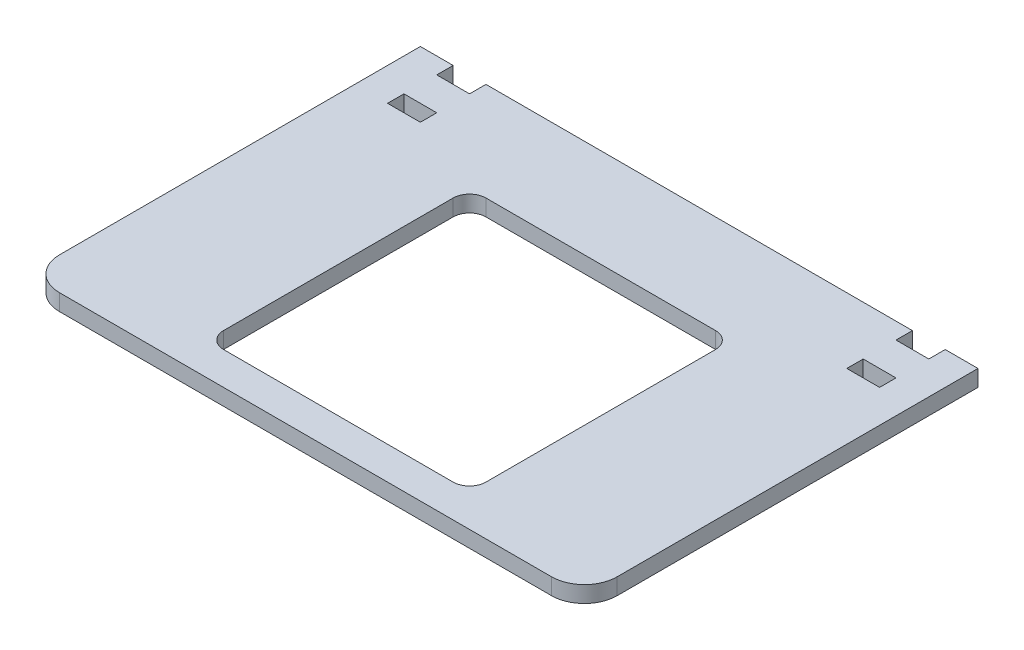
ISO-10303-21;
HEADER;
FILE_DESCRIPTION(('STEP AP214'),'2;1');
FILE_NAME('part.step','',(''),(''),'','','');
FILE_SCHEMA(('AUTOMOTIVE_DESIGN { 1 0 10303 214 1 1 1 1 }'));
ENDSEC;
DATA;
#1=APPLICATION_CONTEXT('core data for automotive mechanical design processes');
#2=APPLICATION_PROTOCOL_DEFINITION('international standard','automotive_design',2000,#1);
#3=PRODUCT_CONTEXT('',#1,'mechanical');
#4=PRODUCT('Part','Part','',(#3));
#5=PRODUCT_RELATED_PRODUCT_CATEGORY('part','',(#4));
#6=PRODUCT_DEFINITION_FORMATION('','',#4);
#7=PRODUCT_DEFINITION_CONTEXT('part definition',#1,'design');
#8=PRODUCT_DEFINITION('design','',#6,#7);
#9=PRODUCT_DEFINITION_SHAPE('','',#8);
#10=(LENGTH_UNIT() NAMED_UNIT(*) SI_UNIT(.MILLI.,.METRE.));
#11=(NAMED_UNIT(*) PLANE_ANGLE_UNIT() SI_UNIT($,.RADIAN.));
#12=(NAMED_UNIT(*) SI_UNIT($,.STERADIAN.) SOLID_ANGLE_UNIT());
#13=UNCERTAINTY_MEASURE_WITH_UNIT(LENGTH_MEASURE(1.E-05),#10,'distance_accuracy_value','');
#14=(GEOMETRIC_REPRESENTATION_CONTEXT(3) GLOBAL_UNCERTAINTY_ASSIGNED_CONTEXT((#13)) GLOBAL_UNIT_ASSIGNED_CONTEXT((#10,
#11,#12)) REPRESENTATION_CONTEXT('',''));
#15=CARTESIAN_POINT('',(0.,0.,0.));
#16=DIRECTION('',(0.,0.,1.));
#17=DIRECTION('',(1.,0.,0.));
#18=AXIS2_PLACEMENT_3D('',#15,#16,#17);
#19=CARTESIAN_POINT('',(-107.95,6.35,-76.2));
#20=DIRECTION('',(0.,0.,1.));
#21=DIRECTION('',(1.,0.,0.));
#22=AXIS2_PLACEMENT_3D('',#19,#20,#21);
#23=PLANE('',#22);
#24=DIRECTION('',(-1.,0.,0.));
#25=VECTOR('',#24,1.);
#26=CARTESIAN_POINT('',(-107.95,0.,-76.2));
#27=LINE('',#26,#25);
#28=CARTESIAN_POINT('',(107.95,0.,-76.2));
#29=VERTEX_POINT('',#28);
#30=CARTESIAN_POINT('',(95.25,0.,-76.2));
#31=VERTEX_POINT('',#30);
#32=EDGE_CURVE('E512',#29,#31,#27,.T.);
#33=ORIENTED_EDGE('',*,*,#32,.T.);
#34=DIRECTION('',(0.,1.,0.));
#35=VECTOR('',#34,1.);
#36=CARTESIAN_POINT('',(95.25,0.,-76.2));
#37=LINE('',#36,#35);
#38=CARTESIAN_POINT('',(95.25,6.35,-76.2));
#39=VERTEX_POINT('',#38);
#40=EDGE_CURVE('E405',#31,#39,#37,.T.);
#41=ORIENTED_EDGE('',*,*,#40,.T.);
#42=DIRECTION('',(-1.,0.,0.));
#43=VECTOR('',#42,1.);
#44=CARTESIAN_POINT('',(-107.95,6.35,-76.2));
#45=LINE('',#44,#43);
#46=CARTESIAN_POINT('',(107.95,6.35,-76.2));
#47=VERTEX_POINT('',#46);
#48=EDGE_CURVE('E495',#47,#39,#45,.T.);
#49=ORIENTED_EDGE('',*,*,#48,.F.);
#50=DIRECTION('',(0.,-1.,0.));
#51=VECTOR('',#50,1.);
#52=CARTESIAN_POINT('',(107.95,6.35,-76.2));
#53=LINE('',#52,#51);
#54=EDGE_CURVE('E527',#47,#29,#53,.T.);
#55=ORIENTED_EDGE('',*,*,#54,.T.);
#56=EDGE_LOOP('',(#33,#41,#49,#55));
#57=FACE_BOUND('',#56,.T.);
#58=ADVANCED_FACE('F39',(#57),#23,.F.);
#59=CARTESIAN_POINT('',(82.55,6.35,-76.2));
#60=VERTEX_POINT('',#59);
#61=CARTESIAN_POINT('',(-82.55,6.35,-76.2));
#62=VERTEX_POINT('',#61);
#63=EDGE_CURVE('E500',#60,#62,#45,.T.);
#64=ORIENTED_EDGE('',*,*,#63,.F.);
#65=DIRECTION('',(0.,1.,0.));
#66=VECTOR('',#65,1.);
#67=CARTESIAN_POINT('',(82.55,0.,-76.2));
#68=LINE('',#67,#66);
#69=CARTESIAN_POINT('',(82.55,0.,-76.2));
#70=VERTEX_POINT('',#69);
#71=EDGE_CURVE('E413',#70,#60,#68,.T.);
#72=ORIENTED_EDGE('',*,*,#71,.F.);
#73=CARTESIAN_POINT('',(-82.55,0.,-76.2));
#74=VERTEX_POINT('',#73);
#75=EDGE_CURVE('E517',#70,#74,#27,.T.);
#76=ORIENTED_EDGE('',*,*,#75,.T.);
#77=DIRECTION('',(0.,1.,0.));
#78=VECTOR('',#77,1.);
#79=CARTESIAN_POINT('',(-82.55,0.,-76.2));
#80=LINE('',#79,#78);
#81=EDGE_CURVE('E430',#74,#62,#80,.T.);
#82=ORIENTED_EDGE('',*,*,#81,.T.);
#83=EDGE_LOOP('',(#64,#72,#76,#82));
#84=FACE_BOUND('',#83,.T.);
#85=ADVANCED_FACE('F582',(#84),#23,.F.);
#86=CARTESIAN_POINT('',(107.95,6.35,-76.2));
#87=DIRECTION('',(-1.,0.,0.));
#88=DIRECTION('',(0.,0.,1.));
#89=AXIS2_PLACEMENT_3D('',#86,#87,#88);
#90=PLANE('',#89);
#91=DIRECTION('',(0.,0.,-1.));
#92=VECTOR('',#91,1.);
#93=CARTESIAN_POINT('',(107.95,6.35,-76.2));
#94=LINE('',#93,#92);
#95=CARTESIAN_POINT('',(107.95,6.35,63.4999999999999));
#96=VERTEX_POINT('',#95);
#97=EDGE_CURVE('E490',#96,#47,#94,.T.);
#98=ORIENTED_EDGE('',*,*,#97,.F.);
#99=DIRECTION('',(0.,-1.,0.));
#100=VECTOR('',#99,1.);
#101=CARTESIAN_POINT('',(107.95,6.35,63.5));
#102=LINE('',#101,#100);
#103=CARTESIAN_POINT('',(107.95,0.,63.4999999999999));
#104=VERTEX_POINT('',#103);
#105=EDGE_CURVE('E11',#96,#104,#102,.T.);
#106=ORIENTED_EDGE('',*,*,#105,.T.);
#107=DIRECTION('',(0.,0.,-1.));
#108=VECTOR('',#107,1.);
#109=CARTESIAN_POINT('',(107.95,0.,-76.2));
#110=LINE('',#109,#108);
#111=EDGE_CURVE('E489',#104,#29,#110,.T.);
#112=ORIENTED_EDGE('',*,*,#111,.T.);
#113=ORIENTED_EDGE('',*,*,#54,.F.);
#114=EDGE_LOOP('',(#98,#106,#112,#113));
#115=FACE_BOUND('',#114,.T.);
#116=ADVANCED_FACE('F615',(#115),#90,.F.);
#117=CARTESIAN_POINT('',(-95.25,6.35,-76.2));
#118=VERTEX_POINT('',#117);
#119=CARTESIAN_POINT('',(-107.95,6.35,-76.2));
#120=VERTEX_POINT('',#119);
#121=EDGE_CURVE('E493',#118,#120,#45,.T.);
#122=ORIENTED_EDGE('',*,*,#121,.F.);
#123=DIRECTION('',(0.,1.,0.));
#124=VECTOR('',#123,1.);
#125=CARTESIAN_POINT('',(-95.25,0.,-76.2));
#126=LINE('',#125,#124);
#127=CARTESIAN_POINT('',(-95.25,0.,-76.2));
#128=VERTEX_POINT('',#127);
#129=EDGE_CURVE('E440',#128,#118,#126,.T.);
#130=ORIENTED_EDGE('',*,*,#129,.F.);
#131=CARTESIAN_POINT('',(-107.95,0.,-76.2));
#132=VERTEX_POINT('',#131);
#133=EDGE_CURVE('E511',#128,#132,#27,.T.);
#134=ORIENTED_EDGE('',*,*,#133,.T.);
#135=DIRECTION('',(0.,-1.,0.));
#136=VECTOR('',#135,1.);
#137=CARTESIAN_POINT('',(-107.95,6.35,-76.2));
#138=LINE('',#137,#136);
#139=EDGE_CURVE('E508',#120,#132,#138,.T.);
#140=ORIENTED_EDGE('',*,*,#139,.F.);
#141=EDGE_LOOP('',(#122,#130,#134,#140));
#142=FACE_BOUND('',#141,.T.);
#143=ADVANCED_FACE('F573',(#142),#23,.F.);
#144=CARTESIAN_POINT('',(-107.95,6.35,-76.2));
#145=DIRECTION('',(1.,0.,0.));
#146=DIRECTION('',(0.,0.,-1.));
#147=AXIS2_PLACEMENT_3D('',#144,#145,#146);
#148=PLANE('',#147);
#149=DIRECTION('',(0.,0.,1.));
#150=VECTOR('',#149,1.);
#151=CARTESIAN_POINT('',(-107.95,0.,-76.2));
#152=LINE('',#151,#150);
#153=CARTESIAN_POINT('',(-107.95,0.,63.4999999999999));
#154=VERTEX_POINT('',#153);
#155=EDGE_CURVE('E516',#132,#154,#152,.T.);
#156=ORIENTED_EDGE('',*,*,#155,.T.);
#157=DIRECTION('',(0.,-1.,0.));
#158=VECTOR('',#157,1.);
#159=CARTESIAN_POINT('',(-107.95,6.35,63.5));
#160=LINE('',#159,#158);
#161=CARTESIAN_POINT('',(-107.95,6.35,63.4999999999999));
#162=VERTEX_POINT('',#161);
#163=EDGE_CURVE('E544',#154,#162,#160,.F.);
#164=ORIENTED_EDGE('',*,*,#163,.T.);
#165=DIRECTION('',(0.,0.,1.));
#166=VECTOR('',#165,1.);
#167=CARTESIAN_POINT('',(-107.95,6.35,-76.2));
#168=LINE('',#167,#166);
#169=EDGE_CURVE('E499',#120,#162,#168,.T.);
#170=ORIENTED_EDGE('',*,*,#169,.F.);
#171=ORIENTED_EDGE('',*,*,#139,.T.);
#172=EDGE_LOOP('',(#156,#164,#170,#171));
#173=FACE_BOUND('',#172,.T.);
#174=ADVANCED_FACE('F569',(#173),#148,.F.);
#175=CARTESIAN_POINT('',(-107.95,6.35,76.2));
#176=DIRECTION('',(0.,0.,-1.));
#177=DIRECTION('',(-1.,0.,0.));
#178=AXIS2_PLACEMENT_3D('',#175,#176,#177);
#179=PLANE('',#178);
#180=DIRECTION('',(1.,0.,0.));
#181=VECTOR('',#180,1.);
#182=CARTESIAN_POINT('',(-107.95,6.35,76.2));
#183=LINE('',#182,#181);
#184=CARTESIAN_POINT('',(-95.25,6.35,76.2));
#185=VERTEX_POINT('',#184);
#186=CARTESIAN_POINT('',(95.25,6.35,76.2));
#187=VERTEX_POINT('',#186);
#188=EDGE_CURVE('E504',#185,#187,#183,.T.);
#189=ORIENTED_EDGE('',*,*,#188,.F.);
#190=DIRECTION('',(0.,-1.,0.));
#191=VECTOR('',#190,1.);
#192=CARTESIAN_POINT('',(-95.25,6.35,76.2));
#193=LINE('',#192,#191);
#194=CARTESIAN_POINT('',(-95.25,0.,76.2));
#195=VERTEX_POINT('',#194);
#196=EDGE_CURVE('E534',#185,#195,#193,.T.);
#197=ORIENTED_EDGE('',*,*,#196,.T.);
#198=DIRECTION('',(1.,0.,0.));
#199=VECTOR('',#198,1.);
#200=CARTESIAN_POINT('',(-107.95,0.,76.2));
#201=LINE('',#200,#199);
#202=CARTESIAN_POINT('',(95.25,0.,76.2));
#203=VERTEX_POINT('',#202);
#204=EDGE_CURVE('E494',#195,#203,#201,.T.);
#205=ORIENTED_EDGE('',*,*,#204,.T.);
#206=DIRECTION('',(0.,-1.,0.));
#207=VECTOR('',#206,1.);
#208=CARTESIAN_POINT('',(95.25,6.35,76.2));
#209=LINE('',#208,#207);
#210=EDGE_CURVE('E531',#203,#187,#209,.F.);
#211=ORIENTED_EDGE('',*,*,#210,.T.);
#212=EDGE_LOOP('',(#189,#197,#205,#211));
#213=FACE_BOUND('',#212,.T.);
#214=ADVANCED_FACE('F561',(#213),#179,.F.);
#215=CARTESIAN_POINT('',(0.,6.35,0.));
#216=DIRECTION('',(0.,1.,0.));
#217=DIRECTION('',(0.,0.,1.));
#218=AXIS2_PLACEMENT_3D('',#215,#216,#217);
#219=PLANE('',#218);
#220=CARTESIAN_POINT('',(-44.45,6.35,57.1500000000001));
#221=DIRECTION('',(0.,1.,0.));
#222=DIRECTION('',(0.,0.,1.));
#223=AXIS2_PLACEMENT_3D('',#220,#221,#222);
#224=CIRCLE('',#223,6.35);
#225=CARTESIAN_POINT('',(-50.8,6.35,57.15));
#226=VERTEX_POINT('',#225);
#227=CARTESIAN_POINT('',(-44.4499999999999,6.35,63.5000000000001));
#228=VERTEX_POINT('',#227);
#229=EDGE_CURVE('E55',#226,#228,#224,.T.);
#230=ORIENTED_EDGE('',*,*,#229,.F.);
#231=DIRECTION('',(0.,0.,1.));
#232=VECTOR('',#231,1.);
#233=CARTESIAN_POINT('',(-50.8,6.35,-31.7499999999999));
#234=LINE('',#233,#232);
#235=CARTESIAN_POINT('',(-50.8,6.35,-31.7499999999999));
#236=VERTEX_POINT('',#235);
#237=EDGE_CURVE('E259',#236,#226,#234,.T.);
#238=ORIENTED_EDGE('',*,*,#237,.F.);
#239=CARTESIAN_POINT('',(-44.45,6.35,-31.7499999999999));
#240=DIRECTION('',(0.,1.,0.));
#241=DIRECTION('',(0.,0.,1.));
#242=AXIS2_PLACEMENT_3D('',#239,#240,#241);
#243=CIRCLE('',#242,6.35);
#244=CARTESIAN_POINT('',(-44.4499999999999,6.35,-38.0999999999999));
#245=VERTEX_POINT('',#244);
#246=EDGE_CURVE('E263',#245,#236,#243,.T.);
#247=ORIENTED_EDGE('',*,*,#246,.F.);
#248=DIRECTION('',(-1.,0.,0.));
#249=VECTOR('',#248,1.);
#250=CARTESIAN_POINT('',(-44.4499999999999,6.35,-38.0999999999999));
#251=LINE('',#250,#249);
#252=CARTESIAN_POINT('',(44.45,6.35,-38.0999999999999));
#253=VERTEX_POINT('',#252);
#254=EDGE_CURVE('E302',#253,#245,#251,.T.);
#255=ORIENTED_EDGE('',*,*,#254,.F.);
#256=CARTESIAN_POINT('',(44.45,6.35,-31.7499999999999));
#257=DIRECTION('',(0.,1.,0.));
#258=DIRECTION('',(0.,0.,-1.));
#259=AXIS2_PLACEMENT_3D('',#256,#257,#258);
#260=CIRCLE('',#259,6.35);
#261=CARTESIAN_POINT('',(50.8,6.35,-31.7499999999999));
#262=VERTEX_POINT('',#261);
#263=EDGE_CURVE('E298',#262,#253,#260,.T.);
#264=ORIENTED_EDGE('',*,*,#263,.F.);
#265=DIRECTION('',(0.,0.,-1.));
#266=VECTOR('',#265,1.);
#267=CARTESIAN_POINT('',(50.8,6.35,-31.7499999999999));
#268=LINE('',#267,#266);
#269=CARTESIAN_POINT('',(50.8,6.35,57.15));
#270=VERTEX_POINT('',#269);
#271=EDGE_CURVE('E294',#270,#262,#268,.T.);
#272=ORIENTED_EDGE('',*,*,#271,.F.);
#273=CARTESIAN_POINT('',(44.45,6.35,57.1500000000001));
#274=DIRECTION('',(0.,1.,0.));
#275=DIRECTION('',(0.,0.,1.));
#276=AXIS2_PLACEMENT_3D('',#273,#274,#275);
#277=CIRCLE('',#276,6.35);
#278=CARTESIAN_POINT('',(44.45,6.35,63.5000000000001));
#279=VERTEX_POINT('',#278);
#280=EDGE_CURVE('E290',#279,#270,#277,.T.);
#281=ORIENTED_EDGE('',*,*,#280,.F.);
#282=DIRECTION('',(1.,0.,0.));
#283=VECTOR('',#282,1.);
#284=CARTESIAN_POINT('',(-44.4499999999999,6.35,63.5000000000001));
#285=LINE('',#284,#283);
#286=EDGE_CURVE('E287',#228,#279,#285,.T.);
#287=ORIENTED_EDGE('',*,*,#286,.F.);
#288=EDGE_LOOP('',(#230,#238,#247,#255,#264,#272,#281,#287));
#289=FACE_BOUND('',#288,.T.);
#290=ORIENTED_EDGE('',*,*,#169,.T.);
#291=CARTESIAN_POINT('',(-95.25,6.35,63.5));
#292=DIRECTION('',(0.,1.,0.));
#293=DIRECTION('',(0.,0.,1.));
#294=AXIS2_PLACEMENT_3D('',#291,#292,#293);
#295=CIRCLE('',#294,12.7);
#296=EDGE_CURVE('E48',#162,#185,#295,.T.);
#297=ORIENTED_EDGE('',*,*,#296,.T.);
#298=ORIENTED_EDGE('',*,*,#188,.T.);
#299=CARTESIAN_POINT('',(95.25,6.35,63.5));
#300=DIRECTION('',(0.,1.,0.));
#301=DIRECTION('',(0.,0.,1.));
#302=AXIS2_PLACEMENT_3D('',#299,#300,#301);
#303=CIRCLE('',#302,12.7);
#304=EDGE_CURVE('E547',#187,#96,#303,.T.);
#305=ORIENTED_EDGE('',*,*,#304,.T.);
#306=ORIENTED_EDGE('',*,*,#97,.T.);
#307=ORIENTED_EDGE('',*,*,#48,.T.);
#308=DIRECTION('',(0.,0.,-1.));
#309=VECTOR('',#308,1.);
#310=CARTESIAN_POINT('',(95.25,6.35,0.));
#311=LINE('',#310,#309);
#312=CARTESIAN_POINT('',(95.25,6.35,-69.85));
#313=VERTEX_POINT('',#312);
#314=EDGE_CURVE('E486',#313,#39,#311,.T.);
#315=ORIENTED_EDGE('',*,*,#314,.F.);
#316=DIRECTION('',(1.,0.,0.));
#317=VECTOR('',#316,1.);
#318=CARTESIAN_POINT('',(0.,6.35,-69.85));
#319=LINE('',#318,#317);
#320=CARTESIAN_POINT('',(82.55,6.35,-69.85));
#321=VERTEX_POINT('',#320);
#322=EDGE_CURVE('E483',#321,#313,#319,.T.);
#323=ORIENTED_EDGE('',*,*,#322,.F.);
#324=DIRECTION('',(0.,0.,1.));
#325=VECTOR('',#324,1.);
#326=CARTESIAN_POINT('',(82.55,6.35,0.));
#327=LINE('',#326,#325);
#328=EDGE_CURVE('E480',#60,#321,#327,.T.);
#329=ORIENTED_EDGE('',*,*,#328,.F.);
#330=ORIENTED_EDGE('',*,*,#63,.T.);
#331=DIRECTION('',(0.,0.,-1.));
#332=VECTOR('',#331,1.);
#333=CARTESIAN_POINT('',(-82.55,6.35,0.));
#334=LINE('',#333,#332);
#335=CARTESIAN_POINT('',(-82.55,6.35,-69.85));
#336=VERTEX_POINT('',#335);
#337=EDGE_CURVE('E451',#336,#62,#334,.T.);
#338=ORIENTED_EDGE('',*,*,#337,.F.);
#339=DIRECTION('',(1.,0.,0.));
#340=VECTOR('',#339,1.);
#341=CARTESIAN_POINT('',(0.,6.35,-69.85));
#342=LINE('',#341,#340);
#343=CARTESIAN_POINT('',(-95.25,6.35,-69.85));
#344=VERTEX_POINT('',#343);
#345=EDGE_CURVE('E448',#344,#336,#342,.T.);
#346=ORIENTED_EDGE('',*,*,#345,.F.);
#347=DIRECTION('',(0.,0.,1.));
#348=VECTOR('',#347,1.);
#349=CARTESIAN_POINT('',(-95.25,6.35,0.));
#350=LINE('',#349,#348);
#351=EDGE_CURVE('E435',#118,#344,#350,.T.);
#352=ORIENTED_EDGE('',*,*,#351,.F.);
#353=ORIENTED_EDGE('',*,*,#121,.T.);
#354=EDGE_LOOP('',(#290,#297,#298,#305,#306,#307,#315,#323,#329,#330,#338,#346,#352,#353));
#355=FACE_BOUND('',#354,.T.);
#356=DIRECTION('',(0.,0.,-1.));
#357=VECTOR('',#356,1.);
#358=CARTESIAN_POINT('',(95.25,6.35,0.));
#359=LINE('',#358,#357);
#360=CARTESIAN_POINT('',(95.25,6.35,-50.8));
#361=VERTEX_POINT('',#360);
#362=CARTESIAN_POINT('',(95.25,6.35,-57.15));
#363=VERTEX_POINT('',#362);
#364=EDGE_CURVE('E476',#361,#363,#359,.T.);
#365=ORIENTED_EDGE('',*,*,#364,.F.);
#366=DIRECTION('',(1.,0.,0.));
#367=VECTOR('',#366,1.);
#368=CARTESIAN_POINT('',(0.,6.35,-50.8));
#369=LINE('',#368,#367);
#370=CARTESIAN_POINT('',(82.5500000000001,6.35,-50.8));
#371=VERTEX_POINT('',#370);
#372=EDGE_CURVE('E473',#371,#361,#369,.T.);
#373=ORIENTED_EDGE('',*,*,#372,.F.);
#374=DIRECTION('',(0.,0.,1.));
#375=VECTOR('',#374,1.);
#376=CARTESIAN_POINT('',(82.5500000000001,6.35,0.));
#377=LINE('',#376,#375);
#378=CARTESIAN_POINT('',(82.5500000000001,6.35,-57.15));
#379=VERTEX_POINT('',#378);
#380=EDGE_CURVE('E470',#379,#371,#377,.T.);
#381=ORIENTED_EDGE('',*,*,#380,.F.);
#382=DIRECTION('',(-1.,0.,0.));
#383=VECTOR('',#382,1.);
#384=CARTESIAN_POINT('',(0.,6.35,-57.15));
#385=LINE('',#384,#383);
#386=EDGE_CURVE('E467',#363,#379,#385,.T.);
#387=ORIENTED_EDGE('',*,*,#386,.F.);
#388=EDGE_LOOP('',(#365,#373,#381,#387));
#389=FACE_BOUND('',#388,.T.);
#390=DIRECTION('',(0.,0.,-1.));
#391=VECTOR('',#390,1.);
#392=CARTESIAN_POINT('',(-82.5500000000001,6.35,0.));
#393=LINE('',#392,#391);
#394=CARTESIAN_POINT('',(-82.5500000000001,6.35,-50.8));
#395=VERTEX_POINT('',#394);
#396=CARTESIAN_POINT('',(-82.5500000000001,6.35,-57.15));
#397=VERTEX_POINT('',#396);
#398=EDGE_CURVE('E463',#395,#397,#393,.T.);
#399=ORIENTED_EDGE('',*,*,#398,.F.);
#400=DIRECTION('',(1.,0.,0.));
#401=VECTOR('',#400,1.);
#402=CARTESIAN_POINT('',(0.,6.35,-50.8));
#403=LINE('',#402,#401);
#404=CARTESIAN_POINT('',(-95.25,6.35,-50.8));
#405=VERTEX_POINT('',#404);
#406=EDGE_CURVE('E460',#405,#395,#403,.T.);
#407=ORIENTED_EDGE('',*,*,#406,.F.);
#408=DIRECTION('',(0.,0.,1.));
#409=VECTOR('',#408,1.);
#410=CARTESIAN_POINT('',(-95.25,6.35,0.));
#411=LINE('',#410,#409);
#412=CARTESIAN_POINT('',(-95.25,6.35,-57.15));
#413=VERTEX_POINT('',#412);
#414=EDGE_CURVE('E457',#413,#405,#411,.T.);
#415=ORIENTED_EDGE('',*,*,#414,.F.);
#416=DIRECTION('',(-1.,0.,0.));
#417=VECTOR('',#416,1.);
#418=CARTESIAN_POINT('',(0.,6.35,-57.15));
#419=LINE('',#418,#417);
#420=EDGE_CURVE('E454',#397,#413,#419,.T.);
#421=ORIENTED_EDGE('',*,*,#420,.F.);
#422=EDGE_LOOP('',(#399,#407,#415,#421));
#423=FACE_BOUND('',#422,.T.);
#424=ADVANCED_FACE('F553',(#289,#355,#389,#423),#219,.T.);
#425=CARTESIAN_POINT('',(0.,0.,0.));
#426=DIRECTION('',(0.,1.,0.));
#427=DIRECTION('',(0.,0.,1.));
#428=AXIS2_PLACEMENT_3D('',#425,#426,#427);
#429=PLANE('',#428);
#430=DIRECTION('',(0.,0.,1.));
#431=VECTOR('',#430,1.);
#432=CARTESIAN_POINT('',(-50.8,0.,-31.7499999999999));
#433=LINE('',#432,#431);
#434=CARTESIAN_POINT('',(-50.8,0.,-31.7499999999999));
#435=VERTEX_POINT('',#434);
#436=CARTESIAN_POINT('',(-50.8,0.,57.15));
#437=VERTEX_POINT('',#436);
#438=EDGE_CURVE('E246',#435,#437,#433,.T.);
#439=ORIENTED_EDGE('',*,*,#438,.T.);
#440=CARTESIAN_POINT('',(-44.45,0.,57.1500000000001));
#441=DIRECTION('',(0.,1.,0.));
#442=DIRECTION('',(0.,0.,1.));
#443=AXIS2_PLACEMENT_3D('',#440,#441,#442);
#444=CIRCLE('',#443,6.35);
#445=CARTESIAN_POINT('',(-44.4499999999999,0.,63.5000000000001));
#446=VERTEX_POINT('',#445);
#447=EDGE_CURVE('E239',#437,#446,#444,.T.);
#448=ORIENTED_EDGE('',*,*,#447,.T.);
#449=DIRECTION('',(1.,0.,0.));
#450=VECTOR('',#449,1.);
#451=CARTESIAN_POINT('',(-44.4499999999999,0.,63.5000000000001));
#452=LINE('',#451,#450);
#453=CARTESIAN_POINT('',(44.45,0.,63.5000000000001));
#454=VERTEX_POINT('',#453);
#455=EDGE_CURVE('E249',#446,#454,#452,.T.);
#456=ORIENTED_EDGE('',*,*,#455,.T.);
#457=CARTESIAN_POINT('',(44.45,0.,57.1500000000001));
#458=DIRECTION('',(0.,1.,0.));
#459=DIRECTION('',(0.,0.,1.));
#460=AXIS2_PLACEMENT_3D('',#457,#458,#459);
#461=CIRCLE('',#460,6.35);
#462=CARTESIAN_POINT('',(50.8,0.,57.15));
#463=VERTEX_POINT('',#462);
#464=EDGE_CURVE('E63',#454,#463,#461,.T.);
#465=ORIENTED_EDGE('',*,*,#464,.T.);
#466=DIRECTION('',(0.,0.,-1.));
#467=VECTOR('',#466,1.);
#468=CARTESIAN_POINT('',(50.8,0.,-31.7499999999999));
#469=LINE('',#468,#467);
#470=CARTESIAN_POINT('',(50.8,0.,-31.7499999999999));
#471=VERTEX_POINT('',#470);
#472=EDGE_CURVE('E268',#463,#471,#469,.T.);
#473=ORIENTED_EDGE('',*,*,#472,.T.);
#474=CARTESIAN_POINT('',(44.45,0.,-31.7499999999999));
#475=DIRECTION('',(0.,1.,0.));
#476=DIRECTION('',(0.,0.,-1.));
#477=AXIS2_PLACEMENT_3D('',#474,#475,#476);
#478=CIRCLE('',#477,6.35);
#479=CARTESIAN_POINT('',(44.45,0.,-38.0999999999999));
#480=VERTEX_POINT('',#479);
#481=EDGE_CURVE('E272',#471,#480,#478,.T.);
#482=ORIENTED_EDGE('',*,*,#481,.T.);
#483=DIRECTION('',(-1.,0.,0.));
#484=VECTOR('',#483,1.);
#485=CARTESIAN_POINT('',(-44.4499999999999,0.,-38.0999999999999));
#486=LINE('',#485,#484);
#487=CARTESIAN_POINT('',(-44.4499999999999,0.,-38.0999999999999));
#488=VERTEX_POINT('',#487);
#489=EDGE_CURVE('E276',#480,#488,#486,.T.);
#490=ORIENTED_EDGE('',*,*,#489,.T.);
#491=CARTESIAN_POINT('',(-44.45,0.,-31.7499999999999));
#492=DIRECTION('',(0.,1.,0.));
#493=DIRECTION('',(0.,0.,1.));
#494=AXIS2_PLACEMENT_3D('',#491,#492,#493);
#495=CIRCLE('',#494,6.35);
#496=EDGE_CURVE('E280',#488,#435,#495,.T.);
#497=ORIENTED_EDGE('',*,*,#496,.T.);
#498=EDGE_LOOP('',(#439,#448,#456,#465,#473,#482,#490,#497));
#499=FACE_BOUND('',#498,.T.);
#500=DIRECTION('',(1.,0.,0.));
#501=VECTOR('',#500,1.);
#502=CARTESIAN_POINT('',(95.25,0.,-50.8));
#503=LINE('',#502,#501);
#504=CARTESIAN_POINT('',(82.5500000000001,0.,-50.8));
#505=VERTEX_POINT('',#504);
#506=CARTESIAN_POINT('',(95.25,0.,-50.8));
#507=VERTEX_POINT('',#506);
#508=EDGE_CURVE('E376',#505,#507,#503,.T.);
#509=ORIENTED_EDGE('',*,*,#508,.T.);
#510=DIRECTION('',(0.,0.,-1.));
#511=VECTOR('',#510,1.);
#512=CARTESIAN_POINT('',(95.25,0.,-57.15));
#513=LINE('',#512,#511);
#514=CARTESIAN_POINT('',(95.25,0.,-57.15));
#515=VERTEX_POINT('',#514);
#516=EDGE_CURVE('E363',#507,#515,#513,.T.);
#517=ORIENTED_EDGE('',*,*,#516,.T.);
#518=DIRECTION('',(-1.,0.,0.));
#519=VECTOR('',#518,1.);
#520=CARTESIAN_POINT('',(95.25,0.,-57.15));
#521=LINE('',#520,#519);
#522=CARTESIAN_POINT('',(82.5500000000001,0.,-57.15));
#523=VERTEX_POINT('',#522);
#524=EDGE_CURVE('E367',#515,#523,#521,.T.);
#525=ORIENTED_EDGE('',*,*,#524,.T.);
#526=DIRECTION('',(0.,0.,1.));
#527=VECTOR('',#526,1.);
#528=CARTESIAN_POINT('',(82.5500000000001,0.,-57.15));
#529=LINE('',#528,#527);
#530=EDGE_CURVE('E372',#523,#505,#529,.T.);
#531=ORIENTED_EDGE('',*,*,#530,.T.);
#532=EDGE_LOOP('',(#509,#517,#525,#531));
#533=FACE_BOUND('',#532,.T.);
#534=DIRECTION('',(1.,0.,0.));
#535=VECTOR('',#534,1.);
#536=CARTESIAN_POINT('',(-95.25,0.,-50.8));
#537=LINE('',#536,#535);
#538=CARTESIAN_POINT('',(-95.25,0.,-50.8));
#539=VERTEX_POINT('',#538);
#540=CARTESIAN_POINT('',(-82.5500000000001,0.,-50.8));
#541=VERTEX_POINT('',#540);
#542=EDGE_CURVE('E343',#539,#541,#537,.T.);
#543=ORIENTED_EDGE('',*,*,#542,.T.);
#544=DIRECTION('',(0.,0.,-1.));
#545=VECTOR('',#544,1.);
#546=CARTESIAN_POINT('',(-82.5500000000001,0.,-57.15));
#547=LINE('',#546,#545);
#548=CARTESIAN_POINT('',(-82.5500000000001,0.,-57.15));
#549=VERTEX_POINT('',#548);
#550=EDGE_CURVE('E330',#541,#549,#547,.T.);
#551=ORIENTED_EDGE('',*,*,#550,.T.);
#552=DIRECTION('',(-1.,0.,0.));
#553=VECTOR('',#552,1.);
#554=CARTESIAN_POINT('',(-95.25,0.,-57.15));
#555=LINE('',#554,#553);
#556=CARTESIAN_POINT('',(-95.25,0.,-57.15));
#557=VERTEX_POINT('',#556);
#558=EDGE_CURVE('E334',#549,#557,#555,.T.);
#559=ORIENTED_EDGE('',*,*,#558,.T.);
#560=DIRECTION('',(0.,0.,1.));
#561=VECTOR('',#560,1.);
#562=CARTESIAN_POINT('',(-95.25,0.,-57.15));
#563=LINE('',#562,#561);
#564=EDGE_CURVE('E339',#557,#539,#563,.T.);
#565=ORIENTED_EDGE('',*,*,#564,.T.);
#566=EDGE_LOOP('',(#543,#551,#559,#565));
#567=FACE_BOUND('',#566,.T.);
#568=ORIENTED_EDGE('',*,*,#204,.F.);
#569=CARTESIAN_POINT('',(-95.25,0.,63.5));
#570=DIRECTION('',(0.,1.,0.));
#571=DIRECTION('',(0.,0.,1.));
#572=AXIS2_PLACEMENT_3D('',#569,#570,#571);
#573=CIRCLE('',#572,12.7);
#574=EDGE_CURVE('E541',#195,#154,#573,.F.);
#575=ORIENTED_EDGE('',*,*,#574,.T.);
#576=ORIENTED_EDGE('',*,*,#155,.F.);
#577=ORIENTED_EDGE('',*,*,#133,.F.);
#578=DIRECTION('',(0.,0.,1.));
#579=VECTOR('',#578,1.);
#580=CARTESIAN_POINT('',(-95.25,0.,-76.2));
#581=LINE('',#580,#579);
#582=CARTESIAN_POINT('',(-95.25,0.,-69.85));
#583=VERTEX_POINT('',#582);
#584=EDGE_CURVE('E422',#128,#583,#581,.T.);
#585=ORIENTED_EDGE('',*,*,#584,.T.);
#586=DIRECTION('',(1.,0.,0.));
#587=VECTOR('',#586,1.);
#588=CARTESIAN_POINT('',(-95.25,0.,-69.85));
#589=LINE('',#588,#587);
#590=CARTESIAN_POINT('',(-82.55,0.,-69.85));
#591=VERTEX_POINT('',#590);
#592=EDGE_CURVE('E426',#583,#591,#589,.T.);
#593=ORIENTED_EDGE('',*,*,#592,.T.);
#594=DIRECTION('',(0.,0.,-1.));
#595=VECTOR('',#594,1.);
#596=CARTESIAN_POINT('',(-82.55,0.,-76.2));
#597=LINE('',#596,#595);
#598=EDGE_CURVE('E352',#591,#74,#597,.T.);
#599=ORIENTED_EDGE('',*,*,#598,.T.);
#600=ORIENTED_EDGE('',*,*,#75,.F.);
#601=DIRECTION('',(0.,0.,1.));
#602=VECTOR('',#601,1.);
#603=CARTESIAN_POINT('',(82.55,0.,-76.2));
#604=LINE('',#603,#602);
#605=CARTESIAN_POINT('',(82.55,0.,-69.85));
#606=VERTEX_POINT('',#605);
#607=EDGE_CURVE('E397',#70,#606,#604,.T.);
#608=ORIENTED_EDGE('',*,*,#607,.T.);
#609=DIRECTION('',(1.,0.,0.));
#610=VECTOR('',#609,1.);
#611=CARTESIAN_POINT('',(95.25,0.,-69.85));
#612=LINE('',#611,#610);
#613=CARTESIAN_POINT('',(95.25,0.,-69.85));
#614=VERTEX_POINT('',#613);
#615=EDGE_CURVE('E401',#606,#614,#612,.T.);
#616=ORIENTED_EDGE('',*,*,#615,.T.);
#617=DIRECTION('',(0.,0.,-1.));
#618=VECTOR('',#617,1.);
#619=CARTESIAN_POINT('',(95.25,0.,-76.2));
#620=LINE('',#619,#618);
#621=EDGE_CURVE('E312',#614,#31,#620,.T.);
#622=ORIENTED_EDGE('',*,*,#621,.T.);
#623=ORIENTED_EDGE('',*,*,#32,.F.);
#624=ORIENTED_EDGE('',*,*,#111,.F.);
#625=CARTESIAN_POINT('',(95.25,0.,63.5));
#626=DIRECTION('',(0.,1.,0.));
#627=DIRECTION('',(0.,0.,1.));
#628=AXIS2_PLACEMENT_3D('',#625,#626,#627);
#629=CIRCLE('',#628,12.7);
#630=EDGE_CURVE('E538',#104,#203,#629,.F.);
#631=ORIENTED_EDGE('',*,*,#630,.T.);
#632=EDGE_LOOP('',(#568,#575,#576,#577,#585,#593,#599,#600,#608,#616,#622,#623,#624,#631));
#633=FACE_BOUND('',#632,.T.);
#634=ADVANCED_FACE('F254',(#499,#533,#567,#633),#429,.F.);
#635=CARTESIAN_POINT('',(-82.55,0.,-76.2));
#636=DIRECTION('',(1.,0.,0.));
#637=DIRECTION('',(0.,0.,-1.));
#638=AXIS2_PLACEMENT_3D('',#635,#636,#637);
#639=PLANE('',#638);
#640=ORIENTED_EDGE('',*,*,#337,.T.);
#641=ORIENTED_EDGE('',*,*,#81,.F.);
#642=ORIENTED_EDGE('',*,*,#598,.F.);
#643=DIRECTION('',(0.,1.,0.));
#644=VECTOR('',#643,1.);
#645=CARTESIAN_POINT('',(-82.55,0.,-69.85));
#646=LINE('',#645,#644);
#647=EDGE_CURVE('E431',#591,#336,#646,.T.);
#648=ORIENTED_EDGE('',*,*,#647,.T.);
#649=EDGE_LOOP('',(#640,#641,#642,#648));
#650=FACE_BOUND('',#649,.T.);
#651=ADVANCED_FACE('F586',(#650),#639,.F.);
#652=CARTESIAN_POINT('',(-95.25,0.,-69.85));
#653=DIRECTION('',(0.,0.,1.));
#654=DIRECTION('',(1.,0.,0.));
#655=AXIS2_PLACEMENT_3D('',#652,#653,#654);
#656=PLANE('',#655);
#657=ORIENTED_EDGE('',*,*,#345,.T.);
#658=ORIENTED_EDGE('',*,*,#647,.F.);
#659=ORIENTED_EDGE('',*,*,#592,.F.);
#660=DIRECTION('',(0.,1.,0.));
#661=VECTOR('',#660,1.);
#662=CARTESIAN_POINT('',(-95.25,0.,-69.85));
#663=LINE('',#662,#661);
#664=EDGE_CURVE('E436',#583,#344,#663,.T.);
#665=ORIENTED_EDGE('',*,*,#664,.T.);
#666=EDGE_LOOP('',(#657,#658,#659,#665));
#667=FACE_BOUND('',#666,.T.);
#668=ADVANCED_FACE('F598',(#667),#656,.F.);
#669=CARTESIAN_POINT('',(-95.25,0.,-76.2));
#670=DIRECTION('',(-1.,0.,0.));
#671=DIRECTION('',(0.,0.,1.));
#672=AXIS2_PLACEMENT_3D('',#669,#670,#671);
#673=PLANE('',#672);
#674=ORIENTED_EDGE('',*,*,#351,.T.);
#675=ORIENTED_EDGE('',*,*,#664,.F.);
#676=ORIENTED_EDGE('',*,*,#584,.F.);
#677=ORIENTED_EDGE('',*,*,#129,.T.);
#678=EDGE_LOOP('',(#674,#675,#676,#677));
#679=FACE_BOUND('',#678,.T.);
#680=ADVANCED_FACE('F596',(#679),#673,.F.);
#681=CARTESIAN_POINT('',(-82.5500000000001,0.,-57.15));
#682=DIRECTION('',(1.,0.,0.));
#683=DIRECTION('',(0.,0.,-1.));
#684=AXIS2_PLACEMENT_3D('',#681,#682,#683);
#685=PLANE('',#684);
#686=ORIENTED_EDGE('',*,*,#398,.T.);
#687=DIRECTION('',(0.,1.,0.));
#688=VECTOR('',#687,1.);
#689=CARTESIAN_POINT('',(-82.5500000000001,0.,-57.15));
#690=LINE('',#689,#688);
#691=EDGE_CURVE('E347',#549,#397,#690,.T.);
#692=ORIENTED_EDGE('',*,*,#691,.F.);
#693=ORIENTED_EDGE('',*,*,#550,.F.);
#694=DIRECTION('',(0.,1.,0.));
#695=VECTOR('',#694,1.);
#696=CARTESIAN_POINT('',(-82.5500000000001,0.,-50.8));
#697=LINE('',#696,#695);
#698=EDGE_CURVE('E348',#541,#395,#697,.T.);
#699=ORIENTED_EDGE('',*,*,#698,.T.);
#700=EDGE_LOOP('',(#686,#692,#693,#699));
#701=FACE_BOUND('',#700,.T.);
#702=ADVANCED_FACE('F605',(#701),#685,.F.);
#703=CARTESIAN_POINT('',(-95.25,0.,-50.8));
#704=DIRECTION('',(0.,0.,1.));
#705=DIRECTION('',(1.,0.,0.));
#706=AXIS2_PLACEMENT_3D('',#703,#704,#705);
#707=PLANE('',#706);
#708=ORIENTED_EDGE('',*,*,#406,.T.);
#709=ORIENTED_EDGE('',*,*,#698,.F.);
#710=ORIENTED_EDGE('',*,*,#542,.F.);
#711=DIRECTION('',(0.,1.,0.));
#712=VECTOR('',#711,1.);
#713=CARTESIAN_POINT('',(-95.25,0.,-50.8));
#714=LINE('',#713,#712);
#715=EDGE_CURVE('E353',#539,#405,#714,.T.);
#716=ORIENTED_EDGE('',*,*,#715,.T.);
#717=EDGE_LOOP('',(#708,#709,#710,#716));
#718=FACE_BOUND('',#717,.T.);
#719=ADVANCED_FACE('F695',(#718),#707,.F.);
#720=CARTESIAN_POINT('',(-95.25,0.,-57.15));
#721=DIRECTION('',(-1.,0.,0.));
#722=DIRECTION('',(0.,0.,1.));
#723=AXIS2_PLACEMENT_3D('',#720,#721,#722);
#724=PLANE('',#723);
#725=ORIENTED_EDGE('',*,*,#414,.T.);
#726=ORIENTED_EDGE('',*,*,#715,.F.);
#727=ORIENTED_EDGE('',*,*,#564,.F.);
#728=DIRECTION('',(0.,1.,0.));
#729=VECTOR('',#728,1.);
#730=CARTESIAN_POINT('',(-95.25,0.,-57.15));
#731=LINE('',#730,#729);
#732=EDGE_CURVE('E357',#557,#413,#731,.T.);
#733=ORIENTED_EDGE('',*,*,#732,.T.);
#734=EDGE_LOOP('',(#725,#726,#727,#733));
#735=FACE_BOUND('',#734,.T.);
#736=ADVANCED_FACE('F677',(#735),#724,.F.);
#737=CARTESIAN_POINT('',(-95.25,0.,-57.15));
#738=DIRECTION('',(0.,0.,-1.));
#739=DIRECTION('',(-1.,0.,0.));
#740=AXIS2_PLACEMENT_3D('',#737,#738,#739);
#741=PLANE('',#740);
#742=ORIENTED_EDGE('',*,*,#420,.T.);
#743=ORIENTED_EDGE('',*,*,#732,.F.);
#744=ORIENTED_EDGE('',*,*,#558,.F.);
#745=ORIENTED_EDGE('',*,*,#691,.T.);
#746=EDGE_LOOP('',(#742,#743,#744,#745));
#747=FACE_BOUND('',#746,.T.);
#748=ADVANCED_FACE('F670',(#747),#741,.F.);
#749=CARTESIAN_POINT('',(95.25,0.,-57.15));
#750=DIRECTION('',(1.,0.,0.));
#751=DIRECTION('',(0.,0.,-1.));
#752=AXIS2_PLACEMENT_3D('',#749,#750,#751);
#753=PLANE('',#752);
#754=ORIENTED_EDGE('',*,*,#364,.T.);
#755=DIRECTION('',(0.,1.,0.));
#756=VECTOR('',#755,1.);
#757=CARTESIAN_POINT('',(95.25,0.,-57.15));
#758=LINE('',#757,#756);
#759=EDGE_CURVE('E380',#515,#363,#758,.T.);
#760=ORIENTED_EDGE('',*,*,#759,.F.);
#761=ORIENTED_EDGE('',*,*,#516,.F.);
#762=DIRECTION('',(0.,1.,0.));
#763=VECTOR('',#762,1.);
#764=CARTESIAN_POINT('',(95.25,0.,-50.8));
#765=LINE('',#764,#763);
#766=EDGE_CURVE('E335',#507,#361,#765,.T.);
#767=ORIENTED_EDGE('',*,*,#766,.T.);
#768=EDGE_LOOP('',(#754,#760,#761,#767));
#769=FACE_BOUND('',#768,.T.);
#770=ADVANCED_FACE('F668',(#769),#753,.F.);
#771=CARTESIAN_POINT('',(95.25,0.,-50.8));
#772=DIRECTION('',(0.,0.,1.));
#773=DIRECTION('',(1.,0.,0.));
#774=AXIS2_PLACEMENT_3D('',#771,#772,#773);
#775=PLANE('',#774);
#776=ORIENTED_EDGE('',*,*,#372,.T.);
#777=ORIENTED_EDGE('',*,*,#766,.F.);
#778=ORIENTED_EDGE('',*,*,#508,.F.);
#779=DIRECTION('',(0.,1.,0.));
#780=VECTOR('',#779,1.);
#781=CARTESIAN_POINT('',(82.5500000000001,0.,-50.8));
#782=LINE('',#781,#780);
#783=EDGE_CURVE('E384',#505,#371,#782,.T.);
#784=ORIENTED_EDGE('',*,*,#783,.T.);
#785=EDGE_LOOP('',(#776,#777,#778,#784));
#786=FACE_BOUND('',#785,.T.);
#787=ADVANCED_FACE('F664',(#786),#775,.F.);
#788=CARTESIAN_POINT('',(82.5500000000001,0.,-57.15));
#789=DIRECTION('',(-1.,0.,0.));
#790=DIRECTION('',(0.,0.,1.));
#791=AXIS2_PLACEMENT_3D('',#788,#789,#790);
#792=PLANE('',#791);
#793=ORIENTED_EDGE('',*,*,#380,.T.);
#794=ORIENTED_EDGE('',*,*,#783,.F.);
#795=ORIENTED_EDGE('',*,*,#530,.F.);
#796=DIRECTION('',(0.,1.,0.));
#797=VECTOR('',#796,1.);
#798=CARTESIAN_POINT('',(82.5500000000001,0.,-57.15));
#799=LINE('',#798,#797);
#800=EDGE_CURVE('E388',#523,#379,#799,.T.);
#801=ORIENTED_EDGE('',*,*,#800,.T.);
#802=EDGE_LOOP('',(#793,#794,#795,#801));
#803=FACE_BOUND('',#802,.T.);
#804=ADVANCED_FACE('F650',(#803),#792,.F.);
#805=CARTESIAN_POINT('',(95.25,0.,-57.15));
#806=DIRECTION('',(0.,0.,-1.));
#807=DIRECTION('',(-1.,0.,0.));
#808=AXIS2_PLACEMENT_3D('',#805,#806,#807);
#809=PLANE('',#808);
#810=ORIENTED_EDGE('',*,*,#386,.T.);
#811=ORIENTED_EDGE('',*,*,#800,.F.);
#812=ORIENTED_EDGE('',*,*,#524,.F.);
#813=ORIENTED_EDGE('',*,*,#759,.T.);
#814=EDGE_LOOP('',(#810,#811,#812,#813));
#815=FACE_BOUND('',#814,.T.);
#816=ADVANCED_FACE('F645',(#815),#809,.F.);
#817=CARTESIAN_POINT('',(95.25,0.,-76.2));
#818=DIRECTION('',(1.,0.,0.));
#819=DIRECTION('',(0.,0.,-1.));
#820=AXIS2_PLACEMENT_3D('',#817,#818,#819);
#821=PLANE('',#820);
#822=ORIENTED_EDGE('',*,*,#314,.T.);
#823=ORIENTED_EDGE('',*,*,#40,.F.);
#824=ORIENTED_EDGE('',*,*,#621,.F.);
#825=DIRECTION('',(0.,1.,0.));
#826=VECTOR('',#825,1.);
#827=CARTESIAN_POINT('',(95.25,0.,-69.85));
#828=LINE('',#827,#826);
#829=EDGE_CURVE('E368',#614,#313,#828,.T.);
#830=ORIENTED_EDGE('',*,*,#829,.T.);
#831=EDGE_LOOP('',(#822,#823,#824,#830));
#832=FACE_BOUND('',#831,.T.);
#833=ADVANCED_FACE('F640',(#832),#821,.F.);
#834=CARTESIAN_POINT('',(95.25,0.,-69.85));
#835=DIRECTION('',(0.,0.,1.));
#836=DIRECTION('',(1.,0.,0.));
#837=AXIS2_PLACEMENT_3D('',#834,#835,#836);
#838=PLANE('',#837);
#839=ORIENTED_EDGE('',*,*,#322,.T.);
#840=ORIENTED_EDGE('',*,*,#829,.F.);
#841=ORIENTED_EDGE('',*,*,#615,.F.);
#842=DIRECTION('',(0.,1.,0.));
#843=VECTOR('',#842,1.);
#844=CARTESIAN_POINT('',(82.55,0.,-69.85));
#845=LINE('',#844,#843);
#846=EDGE_CURVE('E409',#606,#321,#845,.T.);
#847=ORIENTED_EDGE('',*,*,#846,.T.);
#848=EDGE_LOOP('',(#839,#840,#841,#847));
#849=FACE_BOUND('',#848,.T.);
#850=ADVANCED_FACE('F634',(#849),#838,.F.);
#851=CARTESIAN_POINT('',(82.55,0.,-76.2));
#852=DIRECTION('',(-1.,0.,0.));
#853=DIRECTION('',(0.,0.,1.));
#854=AXIS2_PLACEMENT_3D('',#851,#852,#853);
#855=PLANE('',#854);
#856=ORIENTED_EDGE('',*,*,#328,.T.);
#857=ORIENTED_EDGE('',*,*,#846,.F.);
#858=ORIENTED_EDGE('',*,*,#607,.F.);
#859=ORIENTED_EDGE('',*,*,#71,.T.);
#860=EDGE_LOOP('',(#856,#857,#858,#859));
#861=FACE_BOUND('',#860,.T.);
#862=ADVANCED_FACE('F628',(#861),#855,.F.);
#863=CARTESIAN_POINT('',(-95.25,6.35,63.5));
#864=DIRECTION('',(0.,-1.,0.));
#865=DIRECTION('',(0.,0.,-1.));
#866=AXIS2_PLACEMENT_3D('',#863,#864,#865);
#867=CYLINDRICAL_SURFACE('',#866,12.7);
#868=ORIENTED_EDGE('',*,*,#296,.F.);
#869=ORIENTED_EDGE('',*,*,#163,.F.);
#870=ORIENTED_EDGE('',*,*,#574,.F.);
#871=ORIENTED_EDGE('',*,*,#196,.F.);
#872=EDGE_LOOP('',(#868,#869,#870,#871));
#873=FACE_BOUND('',#872,.T.);
#874=ADVANCED_FACE('F564',(#873),#867,.T.);
#875=CARTESIAN_POINT('',(95.25,6.35,63.5));
#876=DIRECTION('',(0.,-1.,0.));
#877=DIRECTION('',(0.,0.,-1.));
#878=AXIS2_PLACEMENT_3D('',#875,#876,#877);
#879=CYLINDRICAL_SURFACE('',#878,12.7);
#880=ORIENTED_EDGE('',*,*,#304,.F.);
#881=ORIENTED_EDGE('',*,*,#210,.F.);
#882=ORIENTED_EDGE('',*,*,#630,.F.);
#883=ORIENTED_EDGE('',*,*,#105,.F.);
#884=EDGE_LOOP('',(#880,#881,#882,#883));
#885=FACE_BOUND('',#884,.T.);
#886=ADVANCED_FACE('F41',(#885),#879,.T.);
#887=CARTESIAN_POINT('',(-44.45,0.,57.1500000000001));
#888=DIRECTION('',(0.,1.,0.));
#889=DIRECTION('',(0.,0.,1.));
#890=AXIS2_PLACEMENT_3D('',#887,#888,#889);
#891=CYLINDRICAL_SURFACE('',#890,6.35);
#892=ORIENTED_EDGE('',*,*,#229,.T.);
#893=DIRECTION('',(0.,1.,0.));
#894=VECTOR('',#893,1.);
#895=CARTESIAN_POINT('',(-44.4499999999999,0.,63.5000000000001));
#896=LINE('',#895,#894);
#897=EDGE_CURVE('E235',#446,#228,#896,.T.);
#898=ORIENTED_EDGE('',*,*,#897,.F.);
#899=ORIENTED_EDGE('',*,*,#447,.F.);
#900=DIRECTION('',(0.,1.,0.));
#901=VECTOR('',#900,1.);
#902=CARTESIAN_POINT('',(-50.8,0.,57.15));
#903=LINE('',#902,#901);
#904=EDGE_CURVE('E309',#437,#226,#903,.T.);
#905=ORIENTED_EDGE('',*,*,#904,.T.);
#906=EDGE_LOOP('',(#892,#898,#899,#905));
#907=FACE_BOUND('',#906,.T.);
#908=ADVANCED_FACE('F237',(#907),#891,.F.);
#909=CARTESIAN_POINT('',(-50.8,0.,-31.7499999999999));
#910=DIRECTION('',(-1.,0.,0.));
#911=DIRECTION('',(0.,0.,1.));
#912=AXIS2_PLACEMENT_3D('',#909,#910,#911);
#913=PLANE('',#912);
#914=ORIENTED_EDGE('',*,*,#237,.T.);
#915=ORIENTED_EDGE('',*,*,#904,.F.);
#916=ORIENTED_EDGE('',*,*,#438,.F.);
#917=DIRECTION('',(0.,1.,0.));
#918=VECTOR('',#917,1.);
#919=CARTESIAN_POINT('',(-50.8,0.,-31.7499999999999));
#920=LINE('',#919,#918);
#921=EDGE_CURVE('E313',#435,#236,#920,.T.);
#922=ORIENTED_EDGE('',*,*,#921,.T.);
#923=EDGE_LOOP('',(#914,#915,#916,#922));
#924=FACE_BOUND('',#923,.T.);
#925=ADVANCED_FACE('F731',(#924),#913,.F.);
#926=CARTESIAN_POINT('',(-44.45,0.,-31.7499999999999));
#927=DIRECTION('',(0.,1.,0.));
#928=DIRECTION('',(0.,0.,1.));
#929=AXIS2_PLACEMENT_3D('',#926,#927,#928);
#930=CYLINDRICAL_SURFACE('',#929,6.35);
#931=ORIENTED_EDGE('',*,*,#246,.T.);
#932=ORIENTED_EDGE('',*,*,#921,.F.);
#933=ORIENTED_EDGE('',*,*,#496,.F.);
#934=DIRECTION('',(0.,1.,0.));
#935=VECTOR('',#934,1.);
#936=CARTESIAN_POINT('',(-44.4499999999999,0.,-38.0999999999999));
#937=LINE('',#936,#935);
#938=EDGE_CURVE('E316',#488,#245,#937,.T.);
#939=ORIENTED_EDGE('',*,*,#938,.T.);
#940=EDGE_LOOP('',(#931,#932,#933,#939));
#941=FACE_BOUND('',#940,.T.);
#942=ADVANCED_FACE('F729',(#941),#930,.F.);
#943=CARTESIAN_POINT('',(-44.4499999999999,0.,-38.0999999999999));
#944=DIRECTION('',(0.,0.,-1.));
#945=DIRECTION('',(-1.,0.,0.));
#946=AXIS2_PLACEMENT_3D('',#943,#944,#945);
#947=PLANE('',#946);
#948=ORIENTED_EDGE('',*,*,#254,.T.);
#949=ORIENTED_EDGE('',*,*,#938,.F.);
#950=ORIENTED_EDGE('',*,*,#489,.F.);
#951=DIRECTION('',(0.,1.,0.));
#952=VECTOR('',#951,1.);
#953=CARTESIAN_POINT('',(44.45,0.,-38.0999999999999));
#954=LINE('',#953,#952);
#955=EDGE_CURVE('E319',#480,#253,#954,.T.);
#956=ORIENTED_EDGE('',*,*,#955,.T.);
#957=EDGE_LOOP('',(#948,#949,#950,#956));
#958=FACE_BOUND('',#957,.T.);
#959=ADVANCED_FACE('F726',(#958),#947,.F.);
#960=CARTESIAN_POINT('',(44.45,0.,-31.7499999999999));
#961=DIRECTION('',(0.,1.,0.));
#962=DIRECTION('',(0.,0.,1.));
#963=AXIS2_PLACEMENT_3D('',#960,#961,#962);
#964=CYLINDRICAL_SURFACE('',#963,6.35);
#965=ORIENTED_EDGE('',*,*,#263,.T.);
#966=ORIENTED_EDGE('',*,*,#955,.F.);
#967=ORIENTED_EDGE('',*,*,#481,.F.);
#968=DIRECTION('',(0.,1.,0.));
#969=VECTOR('',#968,1.);
#970=CARTESIAN_POINT('',(50.8,0.,-31.7499999999999));
#971=LINE('',#970,#969);
#972=EDGE_CURVE('E322',#471,#262,#971,.T.);
#973=ORIENTED_EDGE('',*,*,#972,.T.);
#974=EDGE_LOOP('',(#965,#966,#967,#973));
#975=FACE_BOUND('',#974,.T.);
#976=ADVANCED_FACE('F723',(#975),#964,.F.);
#977=CARTESIAN_POINT('',(50.8,0.,-31.7499999999999));
#978=DIRECTION('',(1.,0.,0.));
#979=DIRECTION('',(0.,0.,-1.));
#980=AXIS2_PLACEMENT_3D('',#977,#978,#979);
#981=PLANE('',#980);
#982=ORIENTED_EDGE('',*,*,#271,.T.);
#983=ORIENTED_EDGE('',*,*,#972,.F.);
#984=ORIENTED_EDGE('',*,*,#472,.F.);
#985=DIRECTION('',(0.,1.,0.));
#986=VECTOR('',#985,1.);
#987=CARTESIAN_POINT('',(50.8,0.,57.15));
#988=LINE('',#987,#986);
#989=EDGE_CURVE('E325',#463,#270,#988,.T.);
#990=ORIENTED_EDGE('',*,*,#989,.T.);
#991=EDGE_LOOP('',(#982,#983,#984,#990));
#992=FACE_BOUND('',#991,.T.);
#993=ADVANCED_FACE('F719',(#992),#981,.F.);
#994=CARTESIAN_POINT('',(44.45,0.,57.1500000000001));
#995=DIRECTION('',(0.,1.,0.));
#996=DIRECTION('',(0.,0.,1.));
#997=AXIS2_PLACEMENT_3D('',#994,#995,#996);
#998=CYLINDRICAL_SURFACE('',#997,6.35);
#999=ORIENTED_EDGE('',*,*,#280,.T.);
#1000=ORIENTED_EDGE('',*,*,#989,.F.);
#1001=ORIENTED_EDGE('',*,*,#464,.F.);
#1002=DIRECTION('',(0.,1.,0.));
#1003=VECTOR('',#1002,1.);
#1004=CARTESIAN_POINT('',(44.45,0.,63.5000000000001));
#1005=LINE('',#1004,#1003);
#1006=EDGE_CURVE('E245',#454,#279,#1005,.T.);
#1007=ORIENTED_EDGE('',*,*,#1006,.T.);
#1008=EDGE_LOOP('',(#999,#1000,#1001,#1007));
#1009=FACE_BOUND('',#1008,.T.);
#1010=ADVANCED_FACE('F716',(#1009),#998,.F.);
#1011=CARTESIAN_POINT('',(-44.4499999999999,0.,63.5000000000001));
#1012=DIRECTION('',(0.,0.,1.));
#1013=DIRECTION('',(1.,0.,0.));
#1014=AXIS2_PLACEMENT_3D('',#1011,#1012,#1013);
#1015=PLANE('',#1014);
#1016=ORIENTED_EDGE('',*,*,#286,.T.);
#1017=ORIENTED_EDGE('',*,*,#1006,.F.);
#1018=ORIENTED_EDGE('',*,*,#455,.F.);
#1019=ORIENTED_EDGE('',*,*,#897,.T.);
#1020=EDGE_LOOP('',(#1016,#1017,#1018,#1019));
#1021=FACE_BOUND('',#1020,.T.);
#1022=ADVANCED_FACE('F250',(#1021),#1015,.F.);
#1023=CLOSED_SHELL('',(#58,#85,#116,#143,#174,#214,#424,#634,#651,#668,#680,#702,#719,#736,#748,
#770,#787,#804,#816,#833,#850,#862,#874,#886,#908,#925,#942,#959,#976,#993,#1010,#1022));
#1024=MANIFOLD_SOLID_BREP('B2',#1023);
#1025=ADVANCED_BREP_SHAPE_REPRESENTATION('',(#18,#1024),#14);
#1026=SHAPE_DEFINITION_REPRESENTATION(#9,#1025);
ENDSEC;
END-ISO-10303-21;
